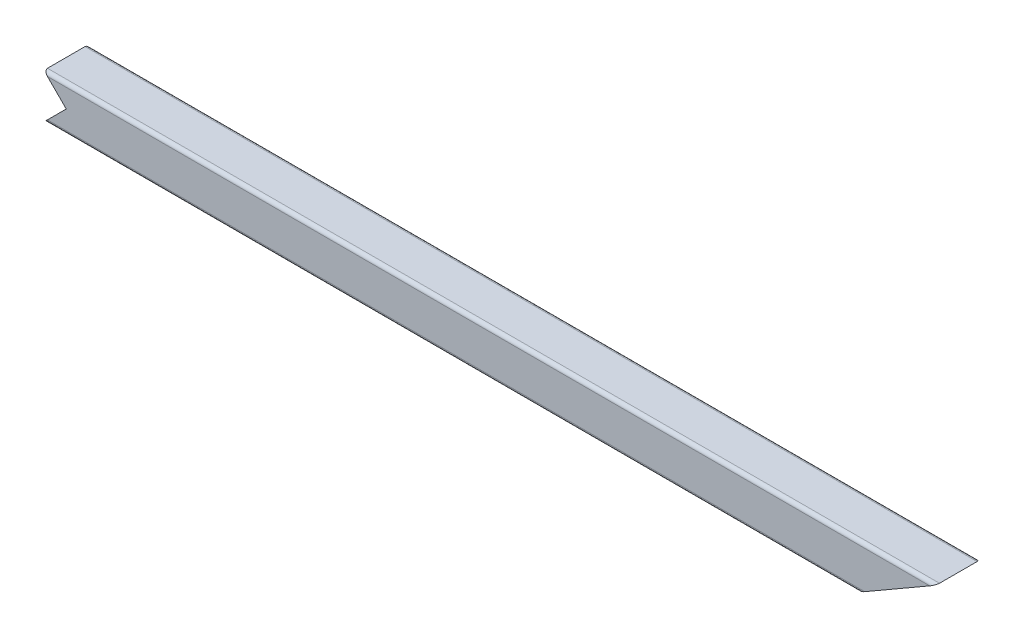
ISO-10303-21;
HEADER;
FILE_DESCRIPTION(('STEP AP214'),'2;1');
FILE_NAME('part.step','',(''),(''),'','','');
FILE_SCHEMA(('AUTOMOTIVE_DESIGN { 1 0 10303 214 1 1 1 1 }'));
ENDSEC;
DATA;
#1=APPLICATION_CONTEXT('core data for automotive mechanical design processes');
#2=APPLICATION_PROTOCOL_DEFINITION('international standard','automotive_design',2000,#1);
#3=PRODUCT_CONTEXT('',#1,'mechanical');
#4=PRODUCT('Part','Part','',(#3));
#5=PRODUCT_RELATED_PRODUCT_CATEGORY('part','',(#4));
#6=PRODUCT_DEFINITION_FORMATION('','',#4);
#7=PRODUCT_DEFINITION_CONTEXT('part definition',#1,'design');
#8=PRODUCT_DEFINITION('design','',#6,#7);
#9=PRODUCT_DEFINITION_SHAPE('','',#8);
#10=(LENGTH_UNIT() NAMED_UNIT(*) SI_UNIT(.MILLI.,.METRE.));
#11=(NAMED_UNIT(*) PLANE_ANGLE_UNIT() SI_UNIT($,.RADIAN.));
#12=(NAMED_UNIT(*) SI_UNIT($,.STERADIAN.) SOLID_ANGLE_UNIT());
#13=UNCERTAINTY_MEASURE_WITH_UNIT(LENGTH_MEASURE(1.E-05),#10,'distance_accuracy_value','');
#14=(GEOMETRIC_REPRESENTATION_CONTEXT(3) GLOBAL_UNCERTAINTY_ASSIGNED_CONTEXT((#13)) GLOBAL_UNIT_ASSIGNED_CONTEXT((#10,
#11,#12)) REPRESENTATION_CONTEXT('',''));
#15=CARTESIAN_POINT('',(0.,0.,0.));
#16=DIRECTION('',(0.,0.,1.));
#17=DIRECTION('',(1.,0.,0.));
#18=AXIS2_PLACEMENT_3D('',#15,#16,#17);
#19=CARTESIAN_POINT('',(508.,21.209,22.225));
#20=DIRECTION('',(0.,0.,-1.));
#21=DIRECTION('',(0.,1.,0.));
#22=AXIS2_PLACEMENT_3D('',#19,#20,#21);
#23=PLANE('',#22);
#24=DIRECTION('',(-1.,0.,0.));
#25=VECTOR('',#24,1.);
#26=CARTESIAN_POINT('',(508.,10.541,22.225));
#27=LINE('',#26,#25);
#28=CARTESIAN_POINT('',(385.766809509612,10.541,22.225));
#29=VERTEX_POINT('',#28);
#30=CARTESIAN_POINT('',(153.416,10.541,22.225));
#31=VERTEX_POINT('',#30);
#32=EDGE_CURVE('E181',#29,#31,#27,.T.);
#33=ORIENTED_EDGE('',*,*,#32,.F.);
#34=DIRECTION('',(-0.866025403784438,-0.5,0.));
#35=VECTOR('',#34,1.);
#36=CARTESIAN_POINT('',(406.004091145246,22.225,22.225));
#37=LINE('',#36,#35);
#38=CARTESIAN_POINT('',(404.244327524756,21.209,22.225));
#39=VERTEX_POINT('',#38);
#40=EDGE_CURVE('E62',#39,#29,#37,.T.);
#41=ORIENTED_EDGE('',*,*,#40,.F.);
#42=DIRECTION('',(-1.,0.,0.));
#43=VECTOR('',#42,1.);
#44=CARTESIAN_POINT('',(508.,21.209,22.225));
#45=LINE('',#44,#43);
#46=CARTESIAN_POINT('',(153.416,21.209,22.225));
#47=VERTEX_POINT('',#46);
#48=EDGE_CURVE('E179',#39,#47,#45,.T.);
#49=ORIENTED_EDGE('',*,*,#48,.T.);
#50=DIRECTION('',(-0.707106781186549,0.707106781186546,0.));
#51=VECTOR('',#50,1.);
#52=CARTESIAN_POINT('',(158.75,15.875,22.225));
#53=LINE('',#52,#51);
#54=CARTESIAN_POINT('',(158.75,15.875,22.225));
#55=VERTEX_POINT('',#54);
#56=EDGE_CURVE('E210',#55,#47,#53,.T.);
#57=ORIENTED_EDGE('',*,*,#56,.F.);
#58=DIRECTION('',(0.707106781186549,0.707106781186546,0.));
#59=VECTOR('',#58,1.);
#60=CARTESIAN_POINT('',(158.75,15.875,22.225));
#61=LINE('',#60,#59);
#62=EDGE_CURVE('E246',#31,#55,#61,.T.);
#63=ORIENTED_EDGE('',*,*,#62,.F.);
#64=EDGE_LOOP('',(#33,#41,#49,#57,#63));
#65=FACE_BOUND('',#64,.T.);
#66=ADVANCED_FACE('F45',(#65),#23,.F.);
#67=CARTESIAN_POINT('',(508.,21.209,21.209));
#68=DIRECTION('',(-1.,0.,0.));
#69=DIRECTION('',(0.,0.,1.));
#70=AXIS2_PLACEMENT_3D('',#67,#68,#69);
#71=CYLINDRICAL_SURFACE('',#70,1.016);
#72=ORIENTED_EDGE('',*,*,#48,.F.);
#73=CARTESIAN_POINT('',(404.244327524756,21.209,21.209));
#74=DIRECTION('',(-0.5,0.866025403784438,0.));
#75=DIRECTION('',(-0.866025403784438,-0.5,0.));
#76=AXIS2_PLACEMENT_3D('',#73,#74,#75);
#77=ELLIPSE('',#76,2.032,1.016);
#78=CARTESIAN_POINT('',(406.004091145246,22.225,21.209));
#79=VERTEX_POINT('',#78);
#80=EDGE_CURVE('E277',#79,#39,#77,.F.);
#81=ORIENTED_EDGE('',*,*,#80,.F.);
#82=DIRECTION('',(-1.,0.,0.));
#83=VECTOR('',#82,1.);
#84=CARTESIAN_POINT('',(508.,22.225,21.209));
#85=LINE('',#84,#83);
#86=CARTESIAN_POINT('',(152.4,22.225,21.209));
#87=VERTEX_POINT('',#86);
#88=EDGE_CURVE('E174',#79,#87,#85,.T.);
#89=ORIENTED_EDGE('',*,*,#88,.T.);
#90=CARTESIAN_POINT('',(153.416,21.209,21.209));
#91=DIRECTION('',(0.707106781186546,0.707106781186549,0.));
#92=DIRECTION('',(-0.707106781186549,0.707106781186546,0.));
#93=AXIS2_PLACEMENT_3D('',#90,#91,#92);
#94=ELLIPSE('',#93,1.43684097937107,1.016);
#95=EDGE_CURVE('E209',#47,#87,#94,.F.);
#96=ORIENTED_EDGE('',*,*,#95,.F.);
#97=EDGE_LOOP('',(#72,#81,#89,#96));
#98=FACE_BOUND('',#97,.T.);
#99=ADVANCED_FACE('F274',(#98),#71,.T.);
#100=CARTESIAN_POINT('',(508.,22.225,10.541));
#101=DIRECTION('',(0.,-1.,0.));
#102=DIRECTION('',(0.,0.,-1.));
#103=AXIS2_PLACEMENT_3D('',#100,#101,#102);
#104=PLANE('',#103);
#105=ORIENTED_EDGE('',*,*,#88,.F.);
#106=DIRECTION('',(0.,0.,-1.));
#107=VECTOR('',#106,1.);
#108=CARTESIAN_POINT('',(406.004091145246,22.225,22.226));
#109=LINE('',#108,#107);
#110=CARTESIAN_POINT('',(406.004091145246,22.225,10.541));
#111=VERTEX_POINT('',#110);
#112=EDGE_CURVE('E280',#79,#111,#109,.T.);
#113=ORIENTED_EDGE('',*,*,#112,.T.);
#114=DIRECTION('',(-1.,0.,0.));
#115=VECTOR('',#114,1.);
#116=CARTESIAN_POINT('',(508.,22.225,10.541));
#117=LINE('',#116,#115);
#118=CARTESIAN_POINT('',(152.4,22.225,10.541));
#119=VERTEX_POINT('',#118);
#120=EDGE_CURVE('E163',#111,#119,#117,.T.);
#121=ORIENTED_EDGE('',*,*,#120,.T.);
#122=DIRECTION('',(0.,0.,-1.));
#123=VECTOR('',#122,1.);
#124=CARTESIAN_POINT('',(152.4,22.225,22.226));
#125=LINE('',#124,#123);
#126=EDGE_CURVE('E231',#87,#119,#125,.T.);
#127=ORIENTED_EDGE('',*,*,#126,.F.);
#128=EDGE_LOOP('',(#105,#113,#121,#127));
#129=FACE_BOUND('',#128,.T.);
#130=ADVANCED_FACE('F279',(#129),#104,.F.);
#131=CARTESIAN_POINT('',(508.,21.209,10.541));
#132=DIRECTION('',(-1.,0.,0.));
#133=DIRECTION('',(0.,0.,1.));
#134=AXIS2_PLACEMENT_3D('',#131,#132,#133);
#135=CYLINDRICAL_SURFACE('',#134,1.016);
#136=ORIENTED_EDGE('',*,*,#120,.F.);
#137=CARTESIAN_POINT('',(404.244327524756,21.209,10.541));
#138=DIRECTION('',(-0.5,0.866025403784438,0.));
#139=DIRECTION('',(-0.866025403784438,-0.5,0.));
#140=AXIS2_PLACEMENT_3D('',#137,#138,#139);
#141=ELLIPSE('',#140,2.032,1.016);
#142=CARTESIAN_POINT('',(404.244327524756,21.209,9.525));
#143=VERTEX_POINT('',#142);
#144=EDGE_CURVE('E148',#143,#111,#141,.F.);
#145=ORIENTED_EDGE('',*,*,#144,.F.);
#146=DIRECTION('',(-1.,0.,0.));
#147=VECTOR('',#146,1.);
#148=CARTESIAN_POINT('',(508.,21.209,9.525));
#149=LINE('',#148,#147);
#150=CARTESIAN_POINT('',(153.416,21.209,9.525));
#151=VERTEX_POINT('',#150);
#152=EDGE_CURVE('E161',#143,#151,#149,.T.);
#153=ORIENTED_EDGE('',*,*,#152,.T.);
#154=CARTESIAN_POINT('',(153.416,21.209,10.541));
#155=DIRECTION('',(0.707106781186546,0.707106781186549,0.));
#156=DIRECTION('',(-0.707106781186549,0.707106781186546,0.));
#157=AXIS2_PLACEMENT_3D('',#154,#155,#156);
#158=ELLIPSE('',#157,1.43684097937107,1.016);
#159=EDGE_CURVE('E218',#119,#151,#158,.F.);
#160=ORIENTED_EDGE('',*,*,#159,.F.);
#161=EDGE_LOOP('',(#136,#145,#153,#160));
#162=FACE_BOUND('',#161,.T.);
#163=ADVANCED_FACE('F159',(#162),#135,.T.);
#164=CARTESIAN_POINT('',(508.,10.541,9.525));
#165=DIRECTION('',(0.,0.,1.));
#166=DIRECTION('',(1.,0.,0.));
#167=AXIS2_PLACEMENT_3D('',#164,#165,#166);
#168=PLANE('',#167);
#169=ORIENTED_EDGE('',*,*,#152,.F.);
#170=DIRECTION('',(0.866025403784438,0.5,0.));
#171=VECTOR('',#170,1.);
#172=CARTESIAN_POINT('',(406.004091145246,22.225,9.525));
#173=LINE('',#172,#171);
#174=CARTESIAN_POINT('',(385.766809509612,10.541,9.525));
#175=VERTEX_POINT('',#174);
#176=EDGE_CURVE('E145',#175,#143,#173,.T.);
#177=ORIENTED_EDGE('',*,*,#176,.F.);
#178=DIRECTION('',(-1.,0.,0.));
#179=VECTOR('',#178,1.);
#180=CARTESIAN_POINT('',(508.,10.541,9.525));
#181=LINE('',#180,#179);
#182=CARTESIAN_POINT('',(153.416,10.541,9.525));
#183=VERTEX_POINT('',#182);
#184=EDGE_CURVE('E171',#175,#183,#181,.T.);
#185=ORIENTED_EDGE('',*,*,#184,.T.);
#186=DIRECTION('',(-0.707106781186549,-0.707106781186546,0.));
#187=VECTOR('',#186,1.);
#188=CARTESIAN_POINT('',(158.75,15.875,9.525));
#189=LINE('',#188,#187);
#190=CARTESIAN_POINT('',(158.75,15.875,9.525));
#191=VERTEX_POINT('',#190);
#192=EDGE_CURVE('E227',#191,#183,#189,.T.);
#193=ORIENTED_EDGE('',*,*,#192,.F.);
#194=DIRECTION('',(0.707106781186549,-0.707106781186546,0.));
#195=VECTOR('',#194,1.);
#196=CARTESIAN_POINT('',(158.75,15.875,9.525));
#197=LINE('',#196,#195);
#198=EDGE_CURVE('E170',#151,#191,#197,.T.);
#199=ORIENTED_EDGE('',*,*,#198,.F.);
#200=EDGE_LOOP('',(#169,#177,#185,#193,#199));
#201=FACE_BOUND('',#200,.T.);
#202=ADVANCED_FACE('F167',(#201),#168,.F.);
#203=CARTESIAN_POINT('',(508.,10.541,10.541));
#204=DIRECTION('',(-1.,0.,0.));
#205=DIRECTION('',(0.,0.,1.));
#206=AXIS2_PLACEMENT_3D('',#203,#204,#205);
#207=CYLINDRICAL_SURFACE('',#206,1.016);
#208=ORIENTED_EDGE('',*,*,#184,.F.);
#209=CARTESIAN_POINT('',(385.766809509611,10.541,10.541));
#210=DIRECTION('',(-0.5,0.866025403784438,0.));
#211=DIRECTION('',(-0.866025403784438,-0.5,0.));
#212=AXIS2_PLACEMENT_3D('',#209,#210,#211);
#213=ELLIPSE('',#212,2.032,1.016);
#214=CARTESIAN_POINT('',(384.007045889122,9.525,10.541));
#215=VERTEX_POINT('',#214);
#216=EDGE_CURVE('E151',#215,#175,#213,.F.);
#217=ORIENTED_EDGE('',*,*,#216,.F.);
#218=DIRECTION('',(-1.,0.,0.));
#219=VECTOR('',#218,1.);
#220=CARTESIAN_POINT('',(508.,9.525,10.541));
#221=LINE('',#220,#219);
#222=CARTESIAN_POINT('',(152.4,9.525,10.541));
#223=VERTEX_POINT('',#222);
#224=EDGE_CURVE('E54',#215,#223,#221,.T.);
#225=ORIENTED_EDGE('',*,*,#224,.T.);
#226=CARTESIAN_POINT('',(153.416,10.541,10.541));
#227=DIRECTION('',(0.707106781186546,-0.707106781186549,0.));
#228=DIRECTION('',(-0.707106781186549,-0.707106781186546,0.));
#229=AXIS2_PLACEMENT_3D('',#226,#227,#228);
#230=ELLIPSE('',#229,1.43684097937107,1.016);
#231=EDGE_CURVE('E214',#183,#223,#230,.F.);
#232=ORIENTED_EDGE('',*,*,#231,.F.);
#233=EDGE_LOOP('',(#208,#217,#225,#232));
#234=FACE_BOUND('',#233,.T.);
#235=ADVANCED_FACE('F254',(#234),#207,.T.);
#236=CARTESIAN_POINT('',(508.,9.525,21.209));
#237=DIRECTION('',(0.,1.,0.));
#238=DIRECTION('',(0.,0.,1.));
#239=AXIS2_PLACEMENT_3D('',#236,#237,#238);
#240=PLANE('',#239);
#241=ORIENTED_EDGE('',*,*,#224,.F.);
#242=DIRECTION('',(0.,0.,-1.));
#243=VECTOR('',#242,1.);
#244=CARTESIAN_POINT('',(384.007045889122,9.525,22.226));
#245=LINE('',#244,#243);
#246=CARTESIAN_POINT('',(384.007045889122,9.525,21.209));
#247=VERTEX_POINT('',#246);
#248=EDGE_CURVE('E155',#247,#215,#245,.T.);
#249=ORIENTED_EDGE('',*,*,#248,.F.);
#250=DIRECTION('',(-1.,0.,0.));
#251=VECTOR('',#250,1.);
#252=CARTESIAN_POINT('',(508.,9.525,21.209));
#253=LINE('',#252,#251);
#254=CARTESIAN_POINT('',(152.4,9.525,21.209));
#255=VERTEX_POINT('',#254);
#256=EDGE_CURVE('E11',#247,#255,#253,.T.);
#257=ORIENTED_EDGE('',*,*,#256,.T.);
#258=DIRECTION('',(0.,0.,-1.));
#259=VECTOR('',#258,1.);
#260=CARTESIAN_POINT('',(152.4,9.525,22.226));
#261=LINE('',#260,#259);
#262=EDGE_CURVE('E234',#255,#223,#261,.T.);
#263=ORIENTED_EDGE('',*,*,#262,.T.);
#264=EDGE_LOOP('',(#241,#249,#257,#263));
#265=FACE_BOUND('',#264,.T.);
#266=ADVANCED_FACE('F261',(#265),#240,.F.);
#267=CARTESIAN_POINT('',(508.,10.541,21.209));
#268=DIRECTION('',(-1.,0.,0.));
#269=DIRECTION('',(0.,0.,1.));
#270=AXIS2_PLACEMENT_3D('',#267,#268,#269);
#271=CYLINDRICAL_SURFACE('',#270,1.016);
#272=ORIENTED_EDGE('',*,*,#256,.F.);
#273=CARTESIAN_POINT('',(385.766809509611,10.541,21.209));
#274=DIRECTION('',(-0.5,0.866025403784438,0.));
#275=DIRECTION('',(-0.866025403784438,-0.5,0.));
#276=AXIS2_PLACEMENT_3D('',#273,#274,#275);
#277=ELLIPSE('',#276,2.032,1.016);
#278=EDGE_CURVE('E265',#29,#247,#277,.F.);
#279=ORIENTED_EDGE('',*,*,#278,.F.);
#280=ORIENTED_EDGE('',*,*,#32,.T.);
#281=CARTESIAN_POINT('',(153.416,10.541,21.209));
#282=DIRECTION('',(0.707106781186546,-0.707106781186549,0.));
#283=DIRECTION('',(-0.707106781186549,-0.707106781186546,0.));
#284=AXIS2_PLACEMENT_3D('',#281,#282,#283);
#285=ELLIPSE('',#284,1.43684097937107,1.016);
#286=EDGE_CURVE('E184',#255,#31,#285,.F.);
#287=ORIENTED_EDGE('',*,*,#286,.F.);
#288=EDGE_LOOP('',(#272,#279,#280,#287));
#289=FACE_BOUND('',#288,.T.);
#290=ADVANCED_FACE('F264',(#289),#271,.T.);
#291=CARTESIAN_POINT('',(508.,20.574,20.574));
#292=DIRECTION('',(0.,0.,-1.));
#293=DIRECTION('',(0.,1.,0.));
#294=AXIS2_PLACEMENT_3D('',#291,#292,#293);
#295=PLANE('',#294);
#296=DIRECTION('',(-0.866025403784438,-0.5,0.));
#297=VECTOR('',#296,1.);
#298=CARTESIAN_POINT('',(406.004091145246,22.225,20.574));
#299=LINE('',#298,#297);
#300=CARTESIAN_POINT('',(403.14447526195,20.574,20.574));
#301=VERTEX_POINT('',#300);
#302=CARTESIAN_POINT('',(386.866661772418,11.176,20.574));
#303=VERTEX_POINT('',#302);
#304=EDGE_CURVE('E287',#301,#303,#299,.T.);
#305=ORIENTED_EDGE('',*,*,#304,.T.);
#306=DIRECTION('',(-1.,0.,0.));
#307=VECTOR('',#306,1.);
#308=CARTESIAN_POINT('',(508.,11.176,20.574));
#309=LINE('',#308,#307);
#310=CARTESIAN_POINT('',(154.051,11.176,20.574));
#311=VERTEX_POINT('',#310);
#312=EDGE_CURVE('E182',#303,#311,#309,.T.);
#313=ORIENTED_EDGE('',*,*,#312,.T.);
#314=DIRECTION('',(0.707106781186549,0.707106781186546,0.));
#315=VECTOR('',#314,1.);
#316=CARTESIAN_POINT('',(158.75,15.875,20.574));
#317=LINE('',#316,#315);
#318=CARTESIAN_POINT('',(158.75,15.875,20.574));
#319=VERTEX_POINT('',#318);
#320=EDGE_CURVE('E213',#311,#319,#317,.T.);
#321=ORIENTED_EDGE('',*,*,#320,.T.);
#322=DIRECTION('',(-0.707106781186549,0.707106781186546,0.));
#323=VECTOR('',#322,1.);
#324=CARTESIAN_POINT('',(158.75,15.875,20.574));
#325=LINE('',#324,#323);
#326=CARTESIAN_POINT('',(154.051,20.574,20.574));
#327=VERTEX_POINT('',#326);
#328=EDGE_CURVE('E205',#319,#327,#325,.T.);
#329=ORIENTED_EDGE('',*,*,#328,.T.);
#330=DIRECTION('',(-1.,0.,0.));
#331=VECTOR('',#330,1.);
#332=CARTESIAN_POINT('',(508.,20.574,20.574));
#333=LINE('',#332,#331);
#334=EDGE_CURVE('E49',#301,#327,#333,.T.);
#335=ORIENTED_EDGE('',*,*,#334,.F.);
#336=EDGE_LOOP('',(#305,#313,#321,#329,#335));
#337=FACE_BOUND('',#336,.T.);
#338=ADVANCED_FACE('F47',(#337),#295,.T.);
#339=CARTESIAN_POINT('',(508.,20.574,11.176));
#340=DIRECTION('',(0.,-1.,0.));
#341=DIRECTION('',(0.,0.,-1.));
#342=AXIS2_PLACEMENT_3D('',#339,#340,#341);
#343=PLANE('',#342);
#344=DIRECTION('',(0.,0.,1.));
#345=VECTOR('',#344,1.);
#346=CARTESIAN_POINT('',(403.14447526195,20.574,22.226));
#347=LINE('',#346,#345);
#348=CARTESIAN_POINT('',(403.14447526195,20.574,11.176));
#349=VERTEX_POINT('',#348);
#350=EDGE_CURVE('E198',#349,#301,#347,.T.);
#351=ORIENTED_EDGE('',*,*,#350,.T.);
#352=ORIENTED_EDGE('',*,*,#334,.T.);
#353=DIRECTION('',(0.,0.,-1.));
#354=VECTOR('',#353,1.);
#355=CARTESIAN_POINT('',(154.051,20.574,22.226));
#356=LINE('',#355,#354);
#357=CARTESIAN_POINT('',(154.051,20.574,11.176));
#358=VERTEX_POINT('',#357);
#359=EDGE_CURVE('E197',#327,#358,#356,.T.);
#360=ORIENTED_EDGE('',*,*,#359,.T.);
#361=DIRECTION('',(-1.,0.,0.));
#362=VECTOR('',#361,1.);
#363=CARTESIAN_POINT('',(508.,20.574,11.176));
#364=LINE('',#363,#362);
#365=EDGE_CURVE('E186',#349,#358,#364,.T.);
#366=ORIENTED_EDGE('',*,*,#365,.F.);
#367=EDGE_LOOP('',(#351,#352,#360,#366));
#368=FACE_BOUND('',#367,.T.);
#369=ADVANCED_FACE('F196',(#368),#343,.T.);
#370=CARTESIAN_POINT('',(508.,11.176,11.176));
#371=DIRECTION('',(0.,0.,1.));
#372=DIRECTION('',(1.,0.,0.));
#373=AXIS2_PLACEMENT_3D('',#370,#371,#372);
#374=PLANE('',#373);
#375=DIRECTION('',(0.866025403784438,0.5,0.));
#376=VECTOR('',#375,1.);
#377=CARTESIAN_POINT('',(406.004091145246,22.225,11.176));
#378=LINE('',#377,#376);
#379=CARTESIAN_POINT('',(386.866661772418,11.176,11.176));
#380=VERTEX_POINT('',#379);
#381=EDGE_CURVE('E70',#380,#349,#378,.T.);
#382=ORIENTED_EDGE('',*,*,#381,.T.);
#383=ORIENTED_EDGE('',*,*,#365,.T.);
#384=DIRECTION('',(0.707106781186549,-0.707106781186546,0.));
#385=VECTOR('',#384,1.);
#386=CARTESIAN_POINT('',(158.75,15.875,11.176));
#387=LINE('',#386,#385);
#388=CARTESIAN_POINT('',(158.75,15.875,11.176));
#389=VERTEX_POINT('',#388);
#390=EDGE_CURVE('E208',#358,#389,#387,.T.);
#391=ORIENTED_EDGE('',*,*,#390,.T.);
#392=DIRECTION('',(-0.707106781186549,-0.707106781186546,0.));
#393=VECTOR('',#392,1.);
#394=CARTESIAN_POINT('',(158.75,15.875,11.176));
#395=LINE('',#394,#393);
#396=CARTESIAN_POINT('',(154.051,11.176,11.176));
#397=VERTEX_POINT('',#396);
#398=EDGE_CURVE('E243',#389,#397,#395,.T.);
#399=ORIENTED_EDGE('',*,*,#398,.T.);
#400=DIRECTION('',(-1.,0.,0.));
#401=VECTOR('',#400,1.);
#402=CARTESIAN_POINT('',(508.,11.176,11.176));
#403=LINE('',#402,#401);
#404=EDGE_CURVE('E185',#380,#397,#403,.T.);
#405=ORIENTED_EDGE('',*,*,#404,.F.);
#406=EDGE_LOOP('',(#382,#383,#391,#399,#405));
#407=FACE_BOUND('',#406,.T.);
#408=ADVANCED_FACE('F297',(#407),#374,.T.);
#409=CARTESIAN_POINT('',(508.,11.176,20.574));
#410=DIRECTION('',(0.,1.,0.));
#411=DIRECTION('',(0.,0.,1.));
#412=AXIS2_PLACEMENT_3D('',#409,#410,#411);
#413=PLANE('',#412);
#414=DIRECTION('',(0.,0.,-1.));
#415=VECTOR('',#414,1.);
#416=CARTESIAN_POINT('',(386.866661772418,11.176,22.226));
#417=LINE('',#416,#415);
#418=EDGE_CURVE('E164',#303,#380,#417,.T.);
#419=ORIENTED_EDGE('',*,*,#418,.T.);
#420=ORIENTED_EDGE('',*,*,#404,.T.);
#421=DIRECTION('',(0.,0.,1.));
#422=VECTOR('',#421,1.);
#423=CARTESIAN_POINT('',(154.051,11.176,22.226));
#424=LINE('',#423,#422);
#425=EDGE_CURVE('E240',#397,#311,#424,.T.);
#426=ORIENTED_EDGE('',*,*,#425,.T.);
#427=ORIENTED_EDGE('',*,*,#312,.F.);
#428=EDGE_LOOP('',(#419,#420,#426,#427));
#429=FACE_BOUND('',#428,.T.);
#430=ADVANCED_FACE('F295',(#429),#413,.T.);
#431=CARTESIAN_POINT('',(158.75,15.875,22.226));
#432=DIRECTION('',(0.707106781186546,-0.707106781186549,0.));
#433=DIRECTION('',(0.707106781186549,0.707106781186546,0.));
#434=AXIS2_PLACEMENT_3D('',#431,#432,#433);
#435=PLANE('',#434);
#436=ORIENTED_EDGE('',*,*,#231,.T.);
#437=ORIENTED_EDGE('',*,*,#262,.F.);
#438=ORIENTED_EDGE('',*,*,#286,.T.);
#439=ORIENTED_EDGE('',*,*,#62,.T.);
#440=DIRECTION('',(0.,0.,-1.));
#441=VECTOR('',#440,1.);
#442=CARTESIAN_POINT('',(158.75,15.875,22.226));
#443=LINE('',#442,#441);
#444=EDGE_CURVE('E237',#55,#319,#443,.T.);
#445=ORIENTED_EDGE('',*,*,#444,.T.);
#446=ORIENTED_EDGE('',*,*,#320,.F.);
#447=ORIENTED_EDGE('',*,*,#425,.F.);
#448=ORIENTED_EDGE('',*,*,#398,.F.);
#449=EDGE_CURVE('E230',#389,#191,#443,.T.);
#450=ORIENTED_EDGE('',*,*,#449,.T.);
#451=ORIENTED_EDGE('',*,*,#192,.T.);
#452=EDGE_LOOP('',(#436,#437,#438,#439,#445,#446,#447,#448,#450,#451));
#453=FACE_BOUND('',#452,.T.);
#454=ADVANCED_FACE('F259',(#453),#435,.F.);
#455=CARTESIAN_POINT('',(158.75,15.875,22.226));
#456=DIRECTION('',(0.707106781186546,0.707106781186549,0.));
#457=DIRECTION('',(-0.707106781186549,0.707106781186546,0.));
#458=AXIS2_PLACEMENT_3D('',#455,#456,#457);
#459=PLANE('',#458);
#460=ORIENTED_EDGE('',*,*,#159,.T.);
#461=ORIENTED_EDGE('',*,*,#198,.T.);
#462=ORIENTED_EDGE('',*,*,#449,.F.);
#463=ORIENTED_EDGE('',*,*,#390,.F.);
#464=ORIENTED_EDGE('',*,*,#359,.F.);
#465=ORIENTED_EDGE('',*,*,#328,.F.);
#466=ORIENTED_EDGE('',*,*,#444,.F.);
#467=ORIENTED_EDGE('',*,*,#56,.T.);
#468=ORIENTED_EDGE('',*,*,#95,.T.);
#469=ORIENTED_EDGE('',*,*,#126,.T.);
#470=EDGE_LOOP('',(#460,#461,#462,#463,#464,#465,#466,#467,#468,#469));
#471=FACE_BOUND('',#470,.T.);
#472=ADVANCED_FACE('F204',(#471),#459,.F.);
#473=CARTESIAN_POINT('',(406.004091145246,22.225,22.226));
#474=DIRECTION('',(-0.5,0.866025403784438,0.));
#475=DIRECTION('',(-0.866025403784438,-0.5,0.));
#476=AXIS2_PLACEMENT_3D('',#473,#474,#475);
#477=PLANE('',#476);
#478=ORIENTED_EDGE('',*,*,#350,.F.);
#479=ORIENTED_EDGE('',*,*,#381,.F.);
#480=ORIENTED_EDGE('',*,*,#418,.F.);
#481=ORIENTED_EDGE('',*,*,#304,.F.);
#482=EDGE_LOOP('',(#478,#479,#480,#481));
#483=FACE_BOUND('',#482,.T.);
#484=ORIENTED_EDGE('',*,*,#144,.T.);
#485=ORIENTED_EDGE('',*,*,#112,.F.);
#486=ORIENTED_EDGE('',*,*,#80,.T.);
#487=ORIENTED_EDGE('',*,*,#40,.T.);
#488=ORIENTED_EDGE('',*,*,#278,.T.);
#489=ORIENTED_EDGE('',*,*,#248,.T.);
#490=ORIENTED_EDGE('',*,*,#216,.T.);
#491=ORIENTED_EDGE('',*,*,#176,.T.);
#492=EDGE_LOOP('',(#484,#485,#486,#487,#488,#489,#490,#491));
#493=FACE_BOUND('',#492,.T.);
#494=ADVANCED_FACE('F147',(#483,#493),#477,.F.);
#495=CLOSED_SHELL('',(#66,#99,#130,#163,#202,#235,#266,#290,#338,#369,#408,#430,#454,#472,#494));
#496=MANIFOLD_SOLID_BREP('B2',#495);
#497=ADVANCED_BREP_SHAPE_REPRESENTATION('',(#18,#496),#14);
#498=SHAPE_DEFINITION_REPRESENTATION(#9,#497);
ENDSEC;
END-ISO-10303-21;
